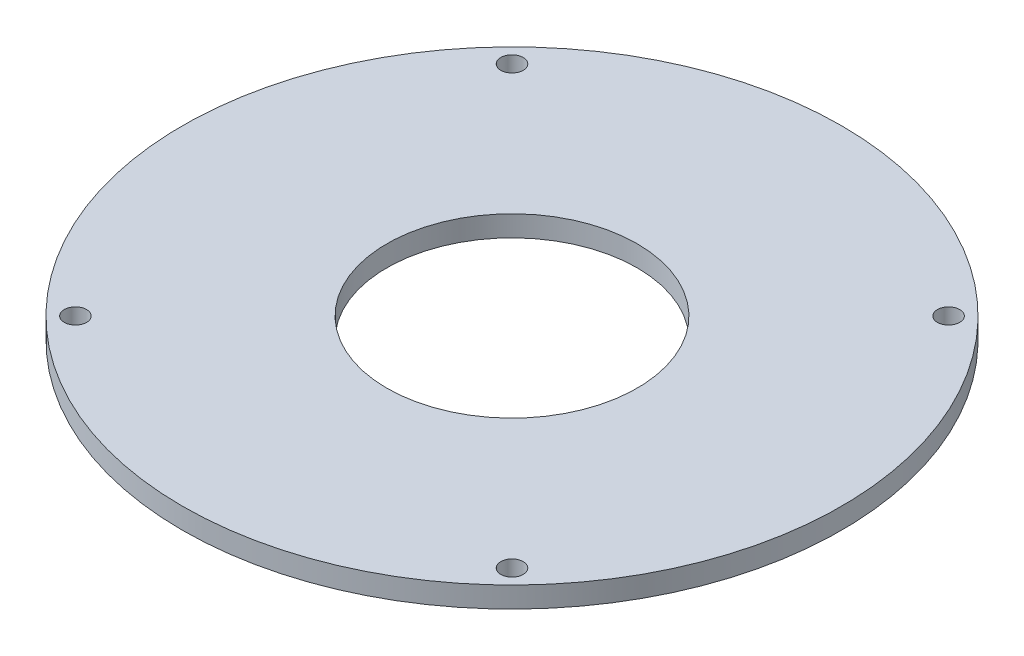
ISO-10303-21;
HEADER;
FILE_DESCRIPTION(('STEP AP214'),'2;1');
FILE_NAME('part.step','',(''),(''),'','','');
FILE_SCHEMA(('AUTOMOTIVE_DESIGN { 1 0 10303 214 1 1 1 1 }'));
ENDSEC;
DATA;
#1=APPLICATION_CONTEXT('core data for automotive mechanical design processes');
#2=APPLICATION_PROTOCOL_DEFINITION('international standard','automotive_design',2000,#1);
#3=PRODUCT_CONTEXT('',#1,'mechanical');
#4=PRODUCT('Part','Part','',(#3));
#5=PRODUCT_RELATED_PRODUCT_CATEGORY('part','',(#4));
#6=PRODUCT_DEFINITION_FORMATION('','',#4);
#7=PRODUCT_DEFINITION_CONTEXT('part definition',#1,'design');
#8=PRODUCT_DEFINITION('design','',#6,#7);
#9=PRODUCT_DEFINITION_SHAPE('','',#8);
#10=(LENGTH_UNIT() NAMED_UNIT(*) SI_UNIT(.MILLI.,.METRE.));
#11=(NAMED_UNIT(*) PLANE_ANGLE_UNIT() SI_UNIT($,.RADIAN.));
#12=(NAMED_UNIT(*) SI_UNIT($,.STERADIAN.) SOLID_ANGLE_UNIT());
#13=UNCERTAINTY_MEASURE_WITH_UNIT(LENGTH_MEASURE(1.E-05),#10,'distance_accuracy_value','');
#14=(GEOMETRIC_REPRESENTATION_CONTEXT(3) GLOBAL_UNCERTAINTY_ASSIGNED_CONTEXT((#13)) GLOBAL_UNIT_ASSIGNED_CONTEXT((#10,
#11,#12)) REPRESENTATION_CONTEXT('',''));
#15=CARTESIAN_POINT('',(0.,0.,0.));
#16=DIRECTION('',(0.,0.,1.));
#17=DIRECTION('',(1.,0.,0.));
#18=AXIS2_PLACEMENT_3D('',#15,#16,#17);
#19=CARTESIAN_POINT('',(0.,1.5875,0.));
#20=DIRECTION('',(0.,1.,0.));
#21=DIRECTION('',(0.,0.,1.));
#22=AXIS2_PLACEMENT_3D('',#19,#20,#21);
#23=PLANE('',#22);
#24=CARTESIAN_POINT('',(-33.2269476479559,1.5875,33.2269476479559));
#25=DIRECTION('',(0.,1.,0.));
#26=DIRECTION('',(0.,0.,1.));
#27=AXIS2_PLACEMENT_3D('',#24,#25,#26);
#28=CIRCLE('',#27,1.69999999999999);
#29=CARTESIAN_POINT('',(-33.2269476479559,1.5875,34.9269476479559));
#30=VERTEX_POINT('',#29);
#31=EDGE_CURVE('E87',#30,#30,#28,.T.);
#32=ORIENTED_EDGE('',*,*,#31,.F.);
#33=EDGE_LOOP('',(#32));
#34=FACE_BOUND('',#33,.T.);
#35=CARTESIAN_POINT('',(-33.2269476479559,1.5875,-33.2269476479559));
#36=DIRECTION('',(0.,1.,0.));
#37=DIRECTION('',(0.,0.,1.));
#38=AXIS2_PLACEMENT_3D('',#35,#36,#37);
#39=CIRCLE('',#38,1.69999999999999);
#40=CARTESIAN_POINT('',(-33.2269476479559,1.5875,-31.5269476479559));
#41=VERTEX_POINT('',#40);
#42=EDGE_CURVE('E79',#41,#41,#39,.T.);
#43=ORIENTED_EDGE('',*,*,#42,.F.);
#44=EDGE_LOOP('',(#43));
#45=FACE_BOUND('',#44,.T.);
#46=CARTESIAN_POINT('',(33.2269476479559,1.5875,-33.2269476479559));
#47=DIRECTION('',(0.,1.,0.));
#48=DIRECTION('',(0.,0.,1.));
#49=AXIS2_PLACEMENT_3D('',#46,#47,#48);
#50=CIRCLE('',#49,1.69999999999999);
#51=CARTESIAN_POINT('',(33.2269476479559,1.5875,-31.5269476479559));
#52=VERTEX_POINT('',#51);
#53=EDGE_CURVE('E71',#52,#52,#50,.T.);
#54=ORIENTED_EDGE('',*,*,#53,.F.);
#55=EDGE_LOOP('',(#54));
#56=FACE_BOUND('',#55,.T.);
#57=CARTESIAN_POINT('',(33.2269476479559,1.5875,33.2269476479559));
#58=DIRECTION('',(0.,1.,0.));
#59=DIRECTION('',(0.,0.,1.));
#60=AXIS2_PLACEMENT_3D('',#57,#58,#59);
#61=CIRCLE('',#60,1.69999999999999);
#62=CARTESIAN_POINT('',(33.2269476479559,1.5875,34.9269476479559));
#63=VERTEX_POINT('',#62);
#64=EDGE_CURVE('E63',#63,#63,#61,.T.);
#65=ORIENTED_EDGE('',*,*,#64,.F.);
#66=EDGE_LOOP('',(#65));
#67=FACE_BOUND('',#66,.T.);
#68=CARTESIAN_POINT('',(0.,1.5875,0.));
#69=DIRECTION('',(0.,1.,0.));
#70=DIRECTION('',(0.,0.,1.));
#71=AXIS2_PLACEMENT_3D('',#68,#69,#70);
#72=CIRCLE('',#71,50.165);
#73=CARTESIAN_POINT('',(0.,1.5875,50.165));
#74=VERTEX_POINT('',#73);
#75=EDGE_CURVE('E10',#74,#74,#72,.T.);
#76=ORIENTED_EDGE('',*,*,#75,.T.);
#77=EDGE_LOOP('',(#76));
#78=FACE_BOUND('',#77,.T.);
#79=CARTESIAN_POINT('',(0.,1.5875,0.));
#80=DIRECTION('',(0.,1.,0.));
#81=DIRECTION('',(0.,0.,1.));
#82=AXIS2_PLACEMENT_3D('',#79,#80,#81);
#83=CIRCLE('',#82,19.05);
#84=CARTESIAN_POINT('',(0.,1.5875,19.05));
#85=VERTEX_POINT('',#84);
#86=EDGE_CURVE('E50',#85,#85,#83,.T.);
#87=ORIENTED_EDGE('',*,*,#86,.F.);
#88=EDGE_LOOP('',(#87));
#89=FACE_BOUND('',#88,.T.);
#90=ADVANCED_FACE('F37',(#34,#45,#56,#67,#78,#89),#23,.T.);
#91=CARTESIAN_POINT('',(0.,-1.5875,0.));
#92=DIRECTION('',(0.,1.,0.));
#93=DIRECTION('',(0.,0.,1.));
#94=AXIS2_PLACEMENT_3D('',#91,#92,#93);
#95=PLANE('',#94);
#96=CARTESIAN_POINT('',(-33.2269476479559,-1.5875,33.2269476479559));
#97=DIRECTION('',(0.,1.,0.));
#98=DIRECTION('',(0.,0.,1.));
#99=AXIS2_PLACEMENT_3D('',#96,#97,#98);
#100=CIRCLE('',#99,1.7);
#101=CARTESIAN_POINT('',(-33.2269476479559,-1.5875,34.9269476479559));
#102=VERTEX_POINT('',#101);
#103=EDGE_CURVE('E83',#102,#102,#100,.T.);
#104=ORIENTED_EDGE('',*,*,#103,.T.);
#105=EDGE_LOOP('',(#104));
#106=FACE_BOUND('',#105,.T.);
#107=CARTESIAN_POINT('',(-33.2269476479559,-1.5875,-33.2269476479559));
#108=DIRECTION('',(0.,1.,0.));
#109=DIRECTION('',(0.,0.,1.));
#110=AXIS2_PLACEMENT_3D('',#107,#108,#109);
#111=CIRCLE('',#110,1.7);
#112=CARTESIAN_POINT('',(-33.2269476479559,-1.5875,-31.5269476479559));
#113=VERTEX_POINT('',#112);
#114=EDGE_CURVE('E75',#113,#113,#111,.T.);
#115=ORIENTED_EDGE('',*,*,#114,.T.);
#116=EDGE_LOOP('',(#115));
#117=FACE_BOUND('',#116,.T.);
#118=CARTESIAN_POINT('',(33.2269476479559,-1.5875,-33.2269476479559));
#119=DIRECTION('',(0.,1.,0.));
#120=DIRECTION('',(0.,0.,1.));
#121=AXIS2_PLACEMENT_3D('',#118,#119,#120);
#122=CIRCLE('',#121,1.7);
#123=CARTESIAN_POINT('',(33.2269476479559,-1.5875,-31.5269476479559));
#124=VERTEX_POINT('',#123);
#125=EDGE_CURVE('E67',#124,#124,#122,.T.);
#126=ORIENTED_EDGE('',*,*,#125,.T.);
#127=EDGE_LOOP('',(#126));
#128=FACE_BOUND('',#127,.T.);
#129=CARTESIAN_POINT('',(33.2269476479559,-1.5875,33.2269476479559));
#130=DIRECTION('',(0.,1.,0.));
#131=DIRECTION('',(0.,0.,1.));
#132=AXIS2_PLACEMENT_3D('',#129,#130,#131);
#133=CIRCLE('',#132,1.7);
#134=CARTESIAN_POINT('',(33.2269476479559,-1.5875,34.9269476479559));
#135=VERTEX_POINT('',#134);
#136=EDGE_CURVE('E56',#135,#135,#133,.T.);
#137=ORIENTED_EDGE('',*,*,#136,.T.);
#138=EDGE_LOOP('',(#137));
#139=FACE_BOUND('',#138,.T.);
#140=CARTESIAN_POINT('',(0.,-1.5875,0.));
#141=DIRECTION('',(0.,1.,0.));
#142=DIRECTION('',(0.,0.,1.));
#143=AXIS2_PLACEMENT_3D('',#140,#141,#142);
#144=CIRCLE('',#143,50.165);
#145=CARTESIAN_POINT('',(0.,-1.5875,50.165));
#146=VERTEX_POINT('',#145);
#147=EDGE_CURVE('E41',#146,#146,#144,.T.);
#148=ORIENTED_EDGE('',*,*,#147,.F.);
#149=EDGE_LOOP('',(#148));
#150=FACE_BOUND('',#149,.T.);
#151=CARTESIAN_POINT('',(0.,-1.5875,0.));
#152=DIRECTION('',(0.,1.,0.));
#153=DIRECTION('',(0.,0.,1.));
#154=AXIS2_PLACEMENT_3D('',#151,#152,#153);
#155=CIRCLE('',#154,19.05);
#156=CARTESIAN_POINT('',(0.,-1.5875,19.05));
#157=VERTEX_POINT('',#156);
#158=EDGE_CURVE('E52',#157,#157,#155,.T.);
#159=ORIENTED_EDGE('',*,*,#158,.T.);
#160=EDGE_LOOP('',(#159));
#161=FACE_BOUND('',#160,.T.);
#162=ADVANCED_FACE('F96',(#106,#117,#128,#139,#150,#161),#95,.F.);
#163=CARTESIAN_POINT('',(0.,1.5875,0.));
#164=DIRECTION('',(0.,-1.,0.));
#165=DIRECTION('',(0.,0.,-1.));
#166=AXIS2_PLACEMENT_3D('',#163,#164,#165);
#167=CYLINDRICAL_SURFACE('',#166,50.165);
#168=ORIENTED_EDGE('',*,*,#75,.F.);
#169=EDGE_LOOP('',(#168));
#170=FACE_BOUND('',#169,.T.);
#171=ORIENTED_EDGE('',*,*,#147,.T.);
#172=EDGE_LOOP('',(#171));
#173=FACE_BOUND('',#172,.T.);
#174=ADVANCED_FACE('F39',(#170,#173),#167,.T.);
#175=CARTESIAN_POINT('',(0.,1.5875,0.));
#176=DIRECTION('',(0.,-1.,0.));
#177=DIRECTION('',(0.,0.,-1.));
#178=AXIS2_PLACEMENT_3D('',#175,#176,#177);
#179=CYLINDRICAL_SURFACE('',#178,19.05);
#180=ORIENTED_EDGE('',*,*,#86,.T.);
#181=EDGE_LOOP('',(#180));
#182=FACE_BOUND('',#181,.T.);
#183=ORIENTED_EDGE('',*,*,#158,.F.);
#184=EDGE_LOOP('',(#183));
#185=FACE_BOUND('',#184,.T.);
#186=ADVANCED_FACE('F106',(#182,#185),#179,.F.);
#187=CARTESIAN_POINT('',(33.2269476479559,1.5875,33.2269476479559));
#188=DIRECTION('',(0.,1.,0.));
#189=DIRECTION('',(0.,0.,1.));
#190=AXIS2_PLACEMENT_3D('',#187,#188,#189);
#191=CYLINDRICAL_SURFACE('',#190,1.69999999999999);
#192=ORIENTED_EDGE('',*,*,#136,.F.);
#193=EDGE_LOOP('',(#192));
#194=FACE_BOUND('',#193,.T.);
#195=ORIENTED_EDGE('',*,*,#64,.T.);
#196=EDGE_LOOP('',(#195));
#197=FACE_BOUND('',#196,.T.);
#198=ADVANCED_FACE('F109',(#194,#197),#191,.F.);
#199=CARTESIAN_POINT('',(33.2269476479559,1.5875,-33.2269476479559));
#200=DIRECTION('',(0.,1.,0.));
#201=DIRECTION('',(0.,0.,1.));
#202=AXIS2_PLACEMENT_3D('',#199,#200,#201);
#203=CYLINDRICAL_SURFACE('',#202,1.69999999999999);
#204=ORIENTED_EDGE('',*,*,#125,.F.);
#205=EDGE_LOOP('',(#204));
#206=FACE_BOUND('',#205,.T.);
#207=ORIENTED_EDGE('',*,*,#53,.T.);
#208=EDGE_LOOP('',(#207));
#209=FACE_BOUND('',#208,.T.);
#210=ADVANCED_FACE('F123',(#206,#209),#203,.F.);
#211=CARTESIAN_POINT('',(-33.2269476479559,1.5875,-33.2269476479559));
#212=DIRECTION('',(0.,1.,0.));
#213=DIRECTION('',(0.,0.,1.));
#214=AXIS2_PLACEMENT_3D('',#211,#212,#213);
#215=CYLINDRICAL_SURFACE('',#214,1.69999999999999);
#216=ORIENTED_EDGE('',*,*,#114,.F.);
#217=EDGE_LOOP('',(#216));
#218=FACE_BOUND('',#217,.T.);
#219=ORIENTED_EDGE('',*,*,#42,.T.);
#220=EDGE_LOOP('',(#219));
#221=FACE_BOUND('',#220,.T.);
#222=ADVANCED_FACE('F127',(#218,#221),#215,.F.);
#223=CARTESIAN_POINT('',(-33.2269476479559,1.5875,33.2269476479559));
#224=DIRECTION('',(0.,1.,0.));
#225=DIRECTION('',(0.,0.,1.));
#226=AXIS2_PLACEMENT_3D('',#223,#224,#225);
#227=CYLINDRICAL_SURFACE('',#226,1.69999999999999);
#228=ORIENTED_EDGE('',*,*,#103,.F.);
#229=EDGE_LOOP('',(#228));
#230=FACE_BOUND('',#229,.T.);
#231=ORIENTED_EDGE('',*,*,#31,.T.);
#232=EDGE_LOOP('',(#231));
#233=FACE_BOUND('',#232,.T.);
#234=ADVANCED_FACE('F92',(#230,#233),#227,.F.);
#235=CLOSED_SHELL('',(#90,#162,#174,#186,#198,#210,#222,#234));
#236=MANIFOLD_SOLID_BREP('B2',#235);
#237=ADVANCED_BREP_SHAPE_REPRESENTATION('',(#18,#236),#14);
#238=SHAPE_DEFINITION_REPRESENTATION(#9,#237);
ENDSEC;
END-ISO-10303-21;
